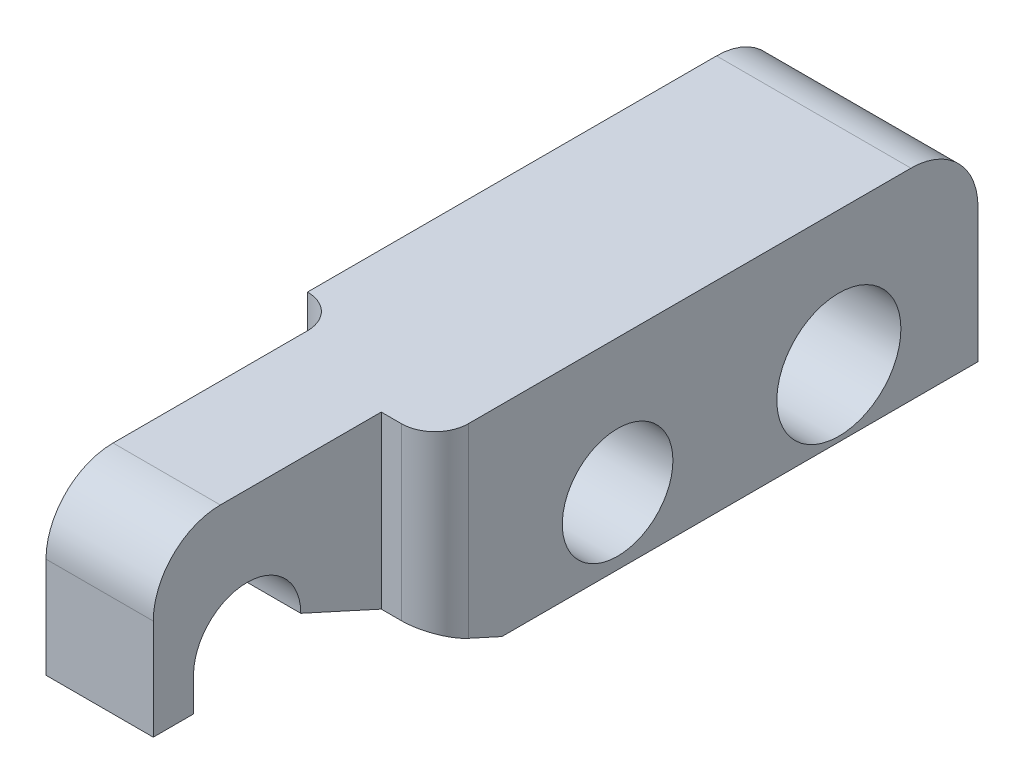
ISO-10303-21;
HEADER;
FILE_DESCRIPTION(('STEP AP214'),'2;1');
FILE_NAME('part.step','',(''),(''),'','','');
FILE_SCHEMA(('AUTOMOTIVE_DESIGN { 1 0 10303 214 1 1 1 1 }'));
ENDSEC;
DATA;
#1=APPLICATION_CONTEXT('core data for automotive mechanical design processes');
#2=APPLICATION_PROTOCOL_DEFINITION('international standard','automotive_design',2000,#1);
#3=PRODUCT_CONTEXT('',#1,'mechanical');
#4=PRODUCT('Part','Part','',(#3));
#5=PRODUCT_RELATED_PRODUCT_CATEGORY('part','',(#4));
#6=PRODUCT_DEFINITION_FORMATION('','',#4);
#7=PRODUCT_DEFINITION_CONTEXT('part definition',#1,'design');
#8=PRODUCT_DEFINITION('design','',#6,#7);
#9=PRODUCT_DEFINITION_SHAPE('','',#8);
#10=(LENGTH_UNIT() NAMED_UNIT(*) SI_UNIT(.MILLI.,.METRE.));
#11=(NAMED_UNIT(*) PLANE_ANGLE_UNIT() SI_UNIT($,.RADIAN.));
#12=(NAMED_UNIT(*) SI_UNIT($,.STERADIAN.) SOLID_ANGLE_UNIT());
#13=UNCERTAINTY_MEASURE_WITH_UNIT(LENGTH_MEASURE(1.E-05),#10,'distance_accuracy_value','');
#14=(GEOMETRIC_REPRESENTATION_CONTEXT(3) GLOBAL_UNCERTAINTY_ASSIGNED_CONTEXT((#13)) GLOBAL_UNIT_ASSIGNED_CONTEXT((#10,
#11,#12)) REPRESENTATION_CONTEXT('',''));
#15=CARTESIAN_POINT('',(0.,0.,0.));
#16=DIRECTION('',(0.,0.,1.));
#17=DIRECTION('',(1.,0.,0.));
#18=AXIS2_PLACEMENT_3D('',#15,#16,#17);
#19=CARTESIAN_POINT('',(2.9,20.,9.425));
#20=DIRECTION('',(0.,0.,-1.));
#21=DIRECTION('',(-1.,0.,0.));
#22=AXIS2_PLACEMENT_3D('',#19,#20,#21);
#23=PLANE('',#22);
#24=DIRECTION('',(0.,1.,0.));
#25=VECTOR('',#24,1.);
#26=CARTESIAN_POINT('',(0.5,19.,9.425));
#27=LINE('',#26,#25);
#28=CARTESIAN_POINT('',(0.5,19.5,9.425));
#29=VERTEX_POINT('',#28);
#30=CARTESIAN_POINT('',(0.5,21.,9.425));
#31=VERTEX_POINT('',#30);
#32=EDGE_CURVE('E250',#29,#31,#27,.T.);
#33=ORIENTED_EDGE('',*,*,#32,.F.);
#34=DIRECTION('',(-1.,0.,0.));
#35=VECTOR('',#34,1.);
#36=CARTESIAN_POINT('',(2.9,19.5,9.425));
#37=LINE('',#36,#35);
#38=CARTESIAN_POINT('',(2.1,19.5,9.425));
#39=VERTEX_POINT('',#38);
#40=EDGE_CURVE('E272',#39,#29,#37,.T.);
#41=ORIENTED_EDGE('',*,*,#40,.F.);
#42=DIRECTION('',(0.,1.,0.));
#43=VECTOR('',#42,1.);
#44=CARTESIAN_POINT('',(2.1,19.,9.425));
#45=LINE('',#44,#43);
#46=CARTESIAN_POINT('',(2.1,21.,9.425));
#47=VERTEX_POINT('',#46);
#48=EDGE_CURVE('E551',#39,#47,#45,.T.);
#49=ORIENTED_EDGE('',*,*,#48,.T.);
#50=DIRECTION('',(-1.,0.,0.));
#51=VECTOR('',#50,1.);
#52=CARTESIAN_POINT('',(2.9,21.,9.425));
#53=LINE('',#52,#51);
#54=EDGE_CURVE('E295',#31,#47,#53,.F.);
#55=ORIENTED_EDGE('',*,*,#54,.F.);
#56=EDGE_LOOP('',(#33,#41,#49,#55));
#57=FACE_BOUND('',#56,.T.);
#58=ADVANCED_FACE('F143',(#57),#23,.F.);
#59=CARTESIAN_POINT('',(2.9,20.,8.025));
#60=DIRECTION('',(-1.,0.,0.));
#61=DIRECTION('',(0.,0.,1.));
#62=AXIS2_PLACEMENT_3D('',#59,#60,#61);
#63=CYLINDRICAL_SURFACE('',#62,0.800000000000001);
#64=DIRECTION('',(-1.,0.,0.));
#65=VECTOR('',#64,1.);
#66=CARTESIAN_POINT('',(2.9,20.,7.225));
#67=LINE('',#66,#65);
#68=CARTESIAN_POINT('',(2.1,20.,7.225));
#69=VERTEX_POINT('',#68);
#70=CARTESIAN_POINT('',(0.500000000000001,20.,7.225));
#71=VERTEX_POINT('',#70);
#72=EDGE_CURVE('E271',#69,#71,#67,.T.);
#73=ORIENTED_EDGE('',*,*,#72,.F.);
#74=CARTESIAN_POINT('',(2.1,20.,8.025));
#75=DIRECTION('',(1.,0.,0.));
#76=DIRECTION('',(0.,0.,1.));
#77=AXIS2_PLACEMENT_3D('',#74,#75,#76);
#78=CIRCLE('',#77,0.800000000000001);
#79=CARTESIAN_POINT('',(2.1,20.,8.825));
#80=VERTEX_POINT('',#79);
#81=EDGE_CURVE('E249',#69,#80,#78,.T.);
#82=ORIENTED_EDGE('',*,*,#81,.T.);
#83=DIRECTION('',(-1.,0.,0.));
#84=VECTOR('',#83,1.);
#85=CARTESIAN_POINT('',(2.9,20.,8.825));
#86=LINE('',#85,#84);
#87=CARTESIAN_POINT('',(0.5,20.,8.825));
#88=VERTEX_POINT('',#87);
#89=EDGE_CURVE('E563',#80,#88,#86,.T.);
#90=ORIENTED_EDGE('',*,*,#89,.T.);
#91=CARTESIAN_POINT('',(0.5,20.,8.025));
#92=DIRECTION('',(1.,0.,0.));
#93=DIRECTION('',(0.,0.,1.));
#94=AXIS2_PLACEMENT_3D('',#91,#92,#93);
#95=CIRCLE('',#94,0.800000000000001);
#96=EDGE_CURVE('E575',#71,#88,#95,.T.);
#97=ORIENTED_EDGE('',*,*,#96,.F.);
#98=EDGE_LOOP('',(#73,#82,#90,#97));
#99=FACE_BOUND('',#98,.T.);
#100=ADVANCED_FACE('F375',(#99),#63,.F.);
#101=CARTESIAN_POINT('',(2.9,22.,9.425));
#102=DIRECTION('',(0.,-1.,0.));
#103=DIRECTION('',(0.,0.,1.));
#104=AXIS2_PLACEMENT_3D('',#101,#102,#103);
#105=PLANE('',#104);
#106=DIRECTION('',(0.,0.,-1.));
#107=VECTOR('',#106,1.);
#108=CARTESIAN_POINT('',(2.9,22.,9.425));
#109=LINE('',#108,#107);
#110=CARTESIAN_POINT('',(2.9,22.,5.525));
#111=VERTEX_POINT('',#110);
#112=CARTESIAN_POINT('',(2.9,22.,-1.075));
#113=VERTEX_POINT('',#112);
#114=EDGE_CURVE('E331',#111,#113,#109,.T.);
#115=ORIENTED_EDGE('',*,*,#114,.T.);
#116=DIRECTION('',(-1.,0.,0.));
#117=VECTOR('',#116,1.);
#118=CARTESIAN_POINT('',(2.9,22.,-1.075));
#119=LINE('',#118,#117);
#120=CARTESIAN_POINT('',(0.,22.,-1.075));
#121=VERTEX_POINT('',#120);
#122=EDGE_CURVE('E281',#121,#113,#119,.F.);
#123=ORIENTED_EDGE('',*,*,#122,.F.);
#124=DIRECTION('',(0.,0.,-1.));
#125=VECTOR('',#124,1.);
#126=CARTESIAN_POINT('',(0.,22.,9.425));
#127=LINE('',#126,#125);
#128=CARTESIAN_POINT('',(0.,22.,5.025));
#129=VERTEX_POINT('',#128);
#130=EDGE_CURVE('E328',#129,#121,#127,.T.);
#131=ORIENTED_EDGE('',*,*,#130,.F.);
#132=CARTESIAN_POINT('',(0.,22.,5.525));
#133=DIRECTION('',(0.,1.,0.));
#134=DIRECTION('',(0.,0.,1.));
#135=AXIS2_PLACEMENT_3D('',#132,#133,#134);
#136=CIRCLE('',#135,0.5);
#137=CARTESIAN_POINT('',(0.500000000000001,22.,5.525));
#138=VERTEX_POINT('',#137);
#139=EDGE_CURVE('E152',#138,#129,#136,.T.);
#140=ORIENTED_EDGE('',*,*,#139,.F.);
#141=DIRECTION('',(0.,0.,-1.));
#142=VECTOR('',#141,1.);
#143=CARTESIAN_POINT('',(0.500000000000001,22.,0.));
#144=LINE('',#143,#142);
#145=CARTESIAN_POINT('',(0.5,22.,8.425));
#146=VERTEX_POINT('',#145);
#147=EDGE_CURVE('E318',#146,#138,#144,.T.);
#148=ORIENTED_EDGE('',*,*,#147,.F.);
#149=DIRECTION('',(-1.,0.,0.));
#150=VECTOR('',#149,1.);
#151=CARTESIAN_POINT('',(2.9,22.,8.425));
#152=LINE('',#151,#150);
#153=CARTESIAN_POINT('',(2.1,22.,8.425));
#154=VERTEX_POINT('',#153);
#155=EDGE_CURVE('E285',#154,#146,#152,.T.);
#156=ORIENTED_EDGE('',*,*,#155,.F.);
#157=DIRECTION('',(0.,0.,-1.));
#158=VECTOR('',#157,1.);
#159=CARTESIAN_POINT('',(2.1,22.,0.));
#160=LINE('',#159,#158);
#161=CARTESIAN_POINT('',(2.1,22.,6.025));
#162=VERTEX_POINT('',#161);
#163=EDGE_CURVE('E586',#154,#162,#160,.T.);
#164=ORIENTED_EDGE('',*,*,#163,.T.);
#165=DIRECTION('',(1.,0.,0.));
#166=VECTOR('',#165,1.);
#167=CARTESIAN_POINT('',(0.,22.,6.025));
#168=LINE('',#167,#166);
#169=CARTESIAN_POINT('',(2.4,22.,6.025));
#170=VERTEX_POINT('',#169);
#171=EDGE_CURVE('E557',#162,#170,#168,.T.);
#172=ORIENTED_EDGE('',*,*,#171,.T.);
#173=CARTESIAN_POINT('',(2.4,22.,5.525));
#174=DIRECTION('',(0.,1.,0.));
#175=DIRECTION('',(0.,0.,1.));
#176=AXIS2_PLACEMENT_3D('',#173,#174,#175);
#177=CIRCLE('',#176,0.5);
#178=EDGE_CURVE('E309',#111,#170,#177,.F.);
#179=ORIENTED_EDGE('',*,*,#178,.F.);
#180=EDGE_LOOP('',(#115,#123,#131,#140,#148,#156,#164,#172,#179));
#181=FACE_BOUND('',#180,.T.);
#182=ADVANCED_FACE('F326',(#181),#105,.F.);
#183=CARTESIAN_POINT('',(2.9,20.,8.825));
#184=DIRECTION('',(0.,0.,-1.));
#185=DIRECTION('',(0.,-1.,0.));
#186=AXIS2_PLACEMENT_3D('',#183,#184,#185);
#187=PLANE('',#186);
#188=ORIENTED_EDGE('',*,*,#89,.F.);
#189=DIRECTION('',(0.,-1.,0.));
#190=VECTOR('',#189,1.);
#191=CARTESIAN_POINT('',(2.1,20.,8.825));
#192=LINE('',#191,#190);
#193=CARTESIAN_POINT('',(2.1,19.5,8.825));
#194=VERTEX_POINT('',#193);
#195=EDGE_CURVE('E578',#80,#194,#192,.T.);
#196=ORIENTED_EDGE('',*,*,#195,.T.);
#197=DIRECTION('',(-1.,0.,0.));
#198=VECTOR('',#197,1.);
#199=CARTESIAN_POINT('',(2.9,19.5,8.825));
#200=LINE('',#199,#198);
#201=CARTESIAN_POINT('',(0.5,19.5,8.825));
#202=VERTEX_POINT('',#201);
#203=EDGE_CURVE('E560',#194,#202,#200,.T.);
#204=ORIENTED_EDGE('',*,*,#203,.T.);
#205=DIRECTION('',(0.,-1.,0.));
#206=VECTOR('',#205,1.);
#207=CARTESIAN_POINT('',(0.5,20.,8.825));
#208=LINE('',#207,#206);
#209=EDGE_CURVE('E572',#88,#202,#208,.T.);
#210=ORIENTED_EDGE('',*,*,#209,.F.);
#211=EDGE_LOOP('',(#188,#196,#204,#210));
#212=FACE_BOUND('',#211,.T.);
#213=ADVANCED_FACE('F401',(#212),#187,.T.);
#214=CARTESIAN_POINT('',(2.9,19.5,0.));
#215=DIRECTION('',(0.,-1.,0.));
#216=DIRECTION('',(0.,0.,1.));
#217=AXIS2_PLACEMENT_3D('',#214,#215,#216);
#218=PLANE('',#217);
#219=ORIENTED_EDGE('',*,*,#203,.F.);
#220=DIRECTION('',(0.,0.,1.));
#221=VECTOR('',#220,1.);
#222=CARTESIAN_POINT('',(2.1,19.5,0.));
#223=LINE('',#222,#221);
#224=EDGE_CURVE('E553',#194,#39,#223,.T.);
#225=ORIENTED_EDGE('',*,*,#224,.T.);
#226=ORIENTED_EDGE('',*,*,#40,.T.);
#227=DIRECTION('',(0.,0.,1.));
#228=VECTOR('',#227,1.);
#229=CARTESIAN_POINT('',(0.500000000000001,19.5,0.));
#230=LINE('',#229,#228);
#231=EDGE_CURVE('E570',#202,#29,#230,.T.);
#232=ORIENTED_EDGE('',*,*,#231,.F.);
#233=EDGE_LOOP('',(#219,#225,#226,#232));
#234=FACE_BOUND('',#233,.T.);
#235=ADVANCED_FACE('F405',(#234),#218,.T.);
#236=CARTESIAN_POINT('',(2.9,17.2782534246575,1.23715753424658));
#237=DIRECTION('',(0.,-0.910366477462605,0.413802944301184));
#238=DIRECTION('',(0.,0.413802944301184,0.910366477462605));
#239=AXIS2_PLACEMENT_3D('',#236,#237,#238);
#240=PLANE('',#239);
#241=DIRECTION('',(-1.,0.,0.));
#242=VECTOR('',#241,1.);
#243=CARTESIAN_POINT('',(2.9,19.4545454545455,6.025));
#244=LINE('',#243,#242);
#245=CARTESIAN_POINT('',(2.4,19.4545454545455,6.025));
#246=VERTEX_POINT('',#245);
#247=CARTESIAN_POINT('',(2.1,19.4545454545455,6.025));
#248=VERTEX_POINT('',#247);
#249=EDGE_CURVE('E282',#246,#248,#244,.T.);
#250=ORIENTED_EDGE('',*,*,#249,.T.);
#251=DIRECTION('',(0.,0.413802944301184,0.910366477462605));
#252=VECTOR('',#251,1.);
#253=CARTESIAN_POINT('',(2.1,17.2782534246575,1.23715753424658));
#254=LINE('',#253,#252);
#255=EDGE_CURVE('E287',#248,#69,#254,.T.);
#256=ORIENTED_EDGE('',*,*,#255,.T.);
#257=ORIENTED_EDGE('',*,*,#72,.T.);
#258=DIRECTION('',(0.,0.413802944301184,0.910366477462605));
#259=VECTOR('',#258,1.);
#260=CARTESIAN_POINT('',(0.500000000000001,17.2782534246575,1.23715753424658));
#261=LINE('',#260,#259);
#262=CARTESIAN_POINT('',(0.500000000000001,19.2272727272727,5.525));
#263=VERTEX_POINT('',#262);
#264=EDGE_CURVE('E277',#263,#71,#261,.T.);
#265=ORIENTED_EDGE('',*,*,#264,.F.);
#266=CARTESIAN_POINT('',(0.,19.2272727272727,5.525));
#267=DIRECTION('',(0.,0.910366477462605,-0.413802944301184));
#268=DIRECTION('',(0.,0.413802944301184,0.910366477462605));
#269=AXIS2_PLACEMENT_3D('',#266,#267,#268);
#270=ELLIPSE('',#269,0.549229362436117,0.5);
#271=CARTESIAN_POINT('',(0.,19.,5.025));
#272=VERTEX_POINT('',#271);
#273=EDGE_CURVE('E12',#272,#263,#270,.F.);
#274=ORIENTED_EDGE('',*,*,#273,.F.);
#275=DIRECTION('',(-1.,0.,0.));
#276=VECTOR('',#275,1.);
#277=CARTESIAN_POINT('',(2.9,19.,5.025));
#278=LINE('',#277,#276);
#279=CARTESIAN_POINT('',(2.9,19.,5.025));
#280=VERTEX_POINT('',#279);
#281=EDGE_CURVE('E265',#280,#272,#278,.T.);
#282=ORIENTED_EDGE('',*,*,#281,.F.);
#283=DIRECTION('',(0.,-0.413802944301184,-0.910366477462605));
#284=VECTOR('',#283,1.);
#285=CARTESIAN_POINT('',(2.9,17.2782534246575,1.23715753424658));
#286=LINE('',#285,#284);
#287=CARTESIAN_POINT('',(2.9,19.2272727272727,5.525));
#288=VERTEX_POINT('',#287);
#289=EDGE_CURVE('E568',#288,#280,#286,.T.);
#290=ORIENTED_EDGE('',*,*,#289,.F.);
#291=CARTESIAN_POINT('',(2.4,19.2272727272727,5.525));
#292=DIRECTION('',(0.,0.910366477462605,-0.413802944301184));
#293=DIRECTION('',(0.,-0.413802944301184,-0.910366477462605));
#294=AXIS2_PLACEMENT_3D('',#291,#292,#293);
#295=ELLIPSE('',#294,0.549229362436117,0.5);
#296=EDGE_CURVE('E314',#246,#288,#295,.T.);
#297=ORIENTED_EDGE('',*,*,#296,.F.);
#298=EDGE_LOOP('',(#250,#256,#257,#265,#274,#282,#290,#297));
#299=FACE_BOUND('',#298,.T.);
#300=ADVANCED_FACE('F275',(#299),#240,.T.);
#301=CARTESIAN_POINT('',(0.,20.,0.));
#302=DIRECTION('',(1.,0.,0.));
#303=DIRECTION('',(0.,0.,-1.));
#304=AXIS2_PLACEMENT_3D('',#301,#302,#303);
#305=PLANE('',#304);
#306=CARTESIAN_POINT('',(0.,20.,0.));
#307=DIRECTION('',(-1.,0.,0.));
#308=DIRECTION('',(0.,0.,-1.));
#309=AXIS2_PLACEMENT_3D('',#306,#307,#308);
#310=CIRCLE('',#309,0.925);
#311=CARTESIAN_POINT('',(0.,20.,-0.925));
#312=VERTEX_POINT('',#311);
#313=EDGE_CURVE('E350',#312,#312,#310,.T.);
#314=ORIENTED_EDGE('',*,*,#313,.F.);
#315=EDGE_LOOP('',(#314));
#316=FACE_BOUND('',#315,.T.);
#317=CARTESIAN_POINT('',(0.,20.,3.3));
#318=DIRECTION('',(-1.,0.,0.));
#319=DIRECTION('',(0.,0.,-1.));
#320=AXIS2_PLACEMENT_3D('',#317,#318,#319);
#321=CIRCLE('',#320,0.825);
#322=CARTESIAN_POINT('',(0.,20.,2.475));
#323=VERTEX_POINT('',#322);
#324=EDGE_CURVE('E334',#323,#323,#321,.T.);
#325=ORIENTED_EDGE('',*,*,#324,.F.);
#326=EDGE_LOOP('',(#325));
#327=FACE_BOUND('',#326,.T.);
#328=DIRECTION('',(0.,1.,0.));
#329=VECTOR('',#328,1.);
#330=CARTESIAN_POINT('',(0.,19.,-2.075));
#331=LINE('',#330,#329);
#332=CARTESIAN_POINT('',(0.,19.,-2.075));
#333=VERTEX_POINT('',#332);
#334=CARTESIAN_POINT('',(0.,21.,-2.075));
#335=VERTEX_POINT('',#334);
#336=EDGE_CURVE('E259',#333,#335,#331,.T.);
#337=ORIENTED_EDGE('',*,*,#336,.F.);
#338=DIRECTION('',(0.,0.,-1.));
#339=VECTOR('',#338,1.);
#340=CARTESIAN_POINT('',(0.,19.,0.));
#341=LINE('',#340,#339);
#342=EDGE_CURVE('E254',#272,#333,#341,.T.);
#343=ORIENTED_EDGE('',*,*,#342,.F.);
#344=DIRECTION('',(0.,1.,0.));
#345=VECTOR('',#344,1.);
#346=CARTESIAN_POINT('',(0.,19.,5.025));
#347=LINE('',#346,#345);
#348=EDGE_CURVE('E242',#272,#129,#347,.T.);
#349=ORIENTED_EDGE('',*,*,#348,.T.);
#350=ORIENTED_EDGE('',*,*,#130,.T.);
#351=CARTESIAN_POINT('',(0.,21.,-1.075));
#352=DIRECTION('',(-1.,0.,0.));
#353=DIRECTION('',(0.,0.,-1.));
#354=AXIS2_PLACEMENT_3D('',#351,#352,#353);
#355=CIRCLE('',#354,1.);
#356=EDGE_CURVE('E302',#335,#121,#355,.F.);
#357=ORIENTED_EDGE('',*,*,#356,.F.);
#358=EDGE_LOOP('',(#337,#343,#349,#350,#357));
#359=FACE_BOUND('',#358,.T.);
#360=ADVANCED_FACE('F256',(#316,#327,#359),#305,.F.);
#361=CARTESIAN_POINT('',(2.9,20.,0.));
#362=DIRECTION('',(1.,0.,0.));
#363=DIRECTION('',(0.,0.,-1.));
#364=AXIS2_PLACEMENT_3D('',#361,#362,#363);
#365=PLANE('',#364);
#366=ORIENTED_EDGE('',*,*,#289,.T.);
#367=DIRECTION('',(0.,0.,-1.));
#368=VECTOR('',#367,1.);
#369=CARTESIAN_POINT('',(2.9,19.,0.));
#370=LINE('',#369,#368);
#371=CARTESIAN_POINT('',(2.9,19.,-2.075));
#372=VERTEX_POINT('',#371);
#373=EDGE_CURVE('E261',#280,#372,#370,.T.);
#374=ORIENTED_EDGE('',*,*,#373,.T.);
#375=DIRECTION('',(0.,1.,0.));
#376=VECTOR('',#375,1.);
#377=CARTESIAN_POINT('',(2.9,19.,-2.075));
#378=LINE('',#377,#376);
#379=CARTESIAN_POINT('',(2.9,21.,-2.075));
#380=VERTEX_POINT('',#379);
#381=EDGE_CURVE('E337',#372,#380,#378,.T.);
#382=ORIENTED_EDGE('',*,*,#381,.T.);
#383=CARTESIAN_POINT('',(2.9,21.,-1.075));
#384=DIRECTION('',(-1.,0.,0.));
#385=DIRECTION('',(0.,0.,-1.));
#386=AXIS2_PLACEMENT_3D('',#383,#384,#385);
#387=CIRCLE('',#386,1.);
#388=EDGE_CURVE('E304',#113,#380,#387,.T.);
#389=ORIENTED_EDGE('',*,*,#388,.F.);
#390=ORIENTED_EDGE('',*,*,#114,.F.);
#391=DIRECTION('',(0.,1.,0.));
#392=VECTOR('',#391,1.);
#393=CARTESIAN_POINT('',(2.9,22.,5.525));
#394=LINE('',#393,#392);
#395=EDGE_CURVE('E307',#288,#111,#394,.T.);
#396=ORIENTED_EDGE('',*,*,#395,.F.);
#397=EDGE_LOOP('',(#366,#374,#382,#389,#390,#396));
#398=FACE_BOUND('',#397,.T.);
#399=CARTESIAN_POINT('',(2.9,20.,0.));
#400=DIRECTION('',(-1.,0.,0.));
#401=DIRECTION('',(0.,0.,-1.));
#402=AXIS2_PLACEMENT_3D('',#399,#400,#401);
#403=CIRCLE('',#402,0.925);
#404=CARTESIAN_POINT('',(2.9,20.,-0.925));
#405=VERTEX_POINT('',#404);
#406=EDGE_CURVE('E347',#405,#405,#403,.T.);
#407=ORIENTED_EDGE('',*,*,#406,.T.);
#408=EDGE_LOOP('',(#407));
#409=FACE_BOUND('',#408,.T.);
#410=CARTESIAN_POINT('',(2.9,20.,3.3));
#411=DIRECTION('',(-1.,0.,0.));
#412=DIRECTION('',(0.,0.,-1.));
#413=AXIS2_PLACEMENT_3D('',#410,#411,#412);
#414=CIRCLE('',#413,0.825);
#415=CARTESIAN_POINT('',(2.9,20.,2.475));
#416=VERTEX_POINT('',#415);
#417=EDGE_CURVE('E329',#416,#416,#414,.T.);
#418=ORIENTED_EDGE('',*,*,#417,.T.);
#419=EDGE_LOOP('',(#418));
#420=FACE_BOUND('',#419,.T.);
#421=ADVANCED_FACE('F357',(#398,#409,#420),#365,.T.);
#422=CARTESIAN_POINT('',(2.9,19.,0.));
#423=DIRECTION('',(0.,-1.,0.));
#424=DIRECTION('',(0.,0.,1.));
#425=AXIS2_PLACEMENT_3D('',#422,#423,#424);
#426=PLANE('',#425);
#427=ORIENTED_EDGE('',*,*,#342,.T.);
#428=DIRECTION('',(-1.,0.,0.));
#429=VECTOR('',#428,1.);
#430=CARTESIAN_POINT('',(2.9,19.,-2.075));
#431=LINE('',#430,#429);
#432=EDGE_CURVE('E262',#372,#333,#431,.T.);
#433=ORIENTED_EDGE('',*,*,#432,.F.);
#434=ORIENTED_EDGE('',*,*,#373,.F.);
#435=ORIENTED_EDGE('',*,*,#281,.T.);
#436=EDGE_LOOP('',(#427,#433,#434,#435));
#437=FACE_BOUND('',#436,.T.);
#438=ADVANCED_FACE('F266',(#437),#426,.T.);
#439=CARTESIAN_POINT('',(2.9,19.,-2.075));
#440=DIRECTION('',(0.,0.,-1.));
#441=DIRECTION('',(-1.,0.,0.));
#442=AXIS2_PLACEMENT_3D('',#439,#440,#441);
#443=PLANE('',#442);
#444=ORIENTED_EDGE('',*,*,#381,.F.);
#445=ORIENTED_EDGE('',*,*,#432,.T.);
#446=ORIENTED_EDGE('',*,*,#336,.T.);
#447=DIRECTION('',(-1.,0.,0.));
#448=VECTOR('',#447,1.);
#449=CARTESIAN_POINT('',(0.,21.,-2.075));
#450=LINE('',#449,#448);
#451=EDGE_CURVE('E300',#380,#335,#450,.T.);
#452=ORIENTED_EDGE('',*,*,#451,.F.);
#453=EDGE_LOOP('',(#444,#445,#446,#452));
#454=FACE_BOUND('',#453,.T.);
#455=ADVANCED_FACE('F360',(#454),#443,.T.);
#456=CARTESIAN_POINT('',(2.9,20.,0.));
#457=DIRECTION('',(-1.,0.,0.));
#458=DIRECTION('',(0.,0.,1.));
#459=AXIS2_PLACEMENT_3D('',#456,#457,#458);
#460=CYLINDRICAL_SURFACE('',#459,0.925);
#461=ORIENTED_EDGE('',*,*,#406,.F.);
#462=EDGE_LOOP('',(#461));
#463=FACE_BOUND('',#462,.T.);
#464=ORIENTED_EDGE('',*,*,#313,.T.);
#465=EDGE_LOOP('',(#464));
#466=FACE_BOUND('',#465,.T.);
#467=ADVANCED_FACE('F389',(#463,#466),#460,.F.);
#468=CARTESIAN_POINT('',(2.9,20.,3.3));
#469=DIRECTION('',(-1.,0.,0.));
#470=DIRECTION('',(0.,0.,1.));
#471=AXIS2_PLACEMENT_3D('',#468,#469,#470);
#472=CYLINDRICAL_SURFACE('',#471,0.825);
#473=ORIENTED_EDGE('',*,*,#417,.F.);
#474=EDGE_LOOP('',(#473));
#475=FACE_BOUND('',#474,.T.);
#476=ORIENTED_EDGE('',*,*,#324,.T.);
#477=EDGE_LOOP('',(#476));
#478=FACE_BOUND('',#477,.T.);
#479=ADVANCED_FACE('F392',(#475,#478),#472,.F.);
#480=CARTESIAN_POINT('',(0.,19.,6.025));
#481=DIRECTION('',(0.,0.,-1.));
#482=DIRECTION('',(-1.,0.,0.));
#483=AXIS2_PLACEMENT_3D('',#480,#481,#482);
#484=PLANE('',#483);
#485=ORIENTED_EDGE('',*,*,#171,.F.);
#486=DIRECTION('',(0.,1.,0.));
#487=VECTOR('',#486,1.);
#488=CARTESIAN_POINT('',(2.1,19.,6.025));
#489=LINE('',#488,#487);
#490=EDGE_CURVE('E323',#248,#162,#489,.T.);
#491=ORIENTED_EDGE('',*,*,#490,.F.);
#492=ORIENTED_EDGE('',*,*,#249,.F.);
#493=DIRECTION('',(0.,1.,0.));
#494=VECTOR('',#493,1.);
#495=CARTESIAN_POINT('',(2.4,19.4545454545455,6.025));
#496=LINE('',#495,#494);
#497=EDGE_CURVE('E312',#170,#246,#496,.F.);
#498=ORIENTED_EDGE('',*,*,#497,.F.);
#499=EDGE_LOOP('',(#485,#491,#492,#498));
#500=FACE_BOUND('',#499,.T.);
#501=ADVANCED_FACE('F395',(#500),#484,.F.);
#502=CARTESIAN_POINT('',(2.1,19.,0.));
#503=DIRECTION('',(-1.,0.,0.));
#504=DIRECTION('',(0.,0.,1.));
#505=AXIS2_PLACEMENT_3D('',#502,#503,#504);
#506=PLANE('',#505);
#507=ORIENTED_EDGE('',*,*,#48,.F.);
#508=ORIENTED_EDGE('',*,*,#224,.F.);
#509=ORIENTED_EDGE('',*,*,#195,.F.);
#510=ORIENTED_EDGE('',*,*,#81,.F.);
#511=ORIENTED_EDGE('',*,*,#255,.F.);
#512=ORIENTED_EDGE('',*,*,#490,.T.);
#513=ORIENTED_EDGE('',*,*,#163,.F.);
#514=CARTESIAN_POINT('',(2.1,21.,8.425));
#515=DIRECTION('',(1.,0.,0.));
#516=DIRECTION('',(0.,0.,1.));
#517=AXIS2_PLACEMENT_3D('',#514,#515,#516);
#518=CIRCLE('',#517,1.);
#519=EDGE_CURVE('E298',#47,#154,#518,.F.);
#520=ORIENTED_EDGE('',*,*,#519,.F.);
#521=EDGE_LOOP('',(#507,#508,#509,#510,#511,#512,#513,#520));
#522=FACE_BOUND('',#521,.T.);
#523=ADVANCED_FACE('F415',(#522),#506,.F.);
#524=CARTESIAN_POINT('',(0.500000000000001,19.,0.));
#525=DIRECTION('',(-1.,0.,0.));
#526=DIRECTION('',(0.,0.,1.));
#527=AXIS2_PLACEMENT_3D('',#524,#525,#526);
#528=PLANE('',#527);
#529=ORIENTED_EDGE('',*,*,#264,.T.);
#530=ORIENTED_EDGE('',*,*,#96,.T.);
#531=ORIENTED_EDGE('',*,*,#209,.T.);
#532=ORIENTED_EDGE('',*,*,#231,.T.);
#533=ORIENTED_EDGE('',*,*,#32,.T.);
#534=CARTESIAN_POINT('',(0.5,21.,8.425));
#535=DIRECTION('',(1.,0.,0.));
#536=DIRECTION('',(0.,0.,1.));
#537=AXIS2_PLACEMENT_3D('',#534,#535,#536);
#538=CIRCLE('',#537,1.);
#539=EDGE_CURVE('E293',#146,#31,#538,.T.);
#540=ORIENTED_EDGE('',*,*,#539,.F.);
#541=ORIENTED_EDGE('',*,*,#147,.T.);
#542=DIRECTION('',(0.,1.,0.));
#543=VECTOR('',#542,1.);
#544=CARTESIAN_POINT('',(0.500000000000001,19.,5.525));
#545=LINE('',#544,#543);
#546=EDGE_CURVE('E159',#263,#138,#545,.T.);
#547=ORIENTED_EDGE('',*,*,#546,.F.);
#548=EDGE_LOOP('',(#529,#530,#531,#532,#533,#540,#541,#547));
#549=FACE_BOUND('',#548,.T.);
#550=ADVANCED_FACE('F319',(#549),#528,.T.);
#551=CARTESIAN_POINT('',(2.9,21.,8.425));
#552=DIRECTION('',(-1.,0.,0.));
#553=DIRECTION('',(0.,0.,1.));
#554=AXIS2_PLACEMENT_3D('',#551,#552,#553);
#555=CYLINDRICAL_SURFACE('',#554,1.);
#556=ORIENTED_EDGE('',*,*,#519,.T.);
#557=ORIENTED_EDGE('',*,*,#155,.T.);
#558=ORIENTED_EDGE('',*,*,#539,.T.);
#559=ORIENTED_EDGE('',*,*,#54,.T.);
#560=EDGE_LOOP('',(#556,#557,#558,#559));
#561=FACE_BOUND('',#560,.T.);
#562=ADVANCED_FACE('F365',(#561),#555,.T.);
#563=CARTESIAN_POINT('',(2.9,21.,-1.075));
#564=DIRECTION('',(1.,0.,0.));
#565=DIRECTION('',(0.,0.,-1.));
#566=AXIS2_PLACEMENT_3D('',#563,#564,#565);
#567=CYLINDRICAL_SURFACE('',#566,1.);
#568=ORIENTED_EDGE('',*,*,#388,.T.);
#569=ORIENTED_EDGE('',*,*,#451,.T.);
#570=ORIENTED_EDGE('',*,*,#356,.T.);
#571=ORIENTED_EDGE('',*,*,#122,.T.);
#572=EDGE_LOOP('',(#568,#569,#570,#571));
#573=FACE_BOUND('',#572,.T.);
#574=ADVANCED_FACE('F362',(#573),#567,.T.);
#575=CARTESIAN_POINT('',(2.4,20.,5.525));
#576=DIRECTION('',(0.,-1.,0.));
#577=DIRECTION('',(0.,0.,1.));
#578=AXIS2_PLACEMENT_3D('',#575,#576,#577);
#579=CYLINDRICAL_SURFACE('',#578,0.5);
#580=ORIENTED_EDGE('',*,*,#296,.T.);
#581=ORIENTED_EDGE('',*,*,#395,.T.);
#582=ORIENTED_EDGE('',*,*,#178,.T.);
#583=ORIENTED_EDGE('',*,*,#497,.T.);
#584=EDGE_LOOP('',(#580,#581,#582,#583));
#585=FACE_BOUND('',#584,.T.);
#586=ADVANCED_FACE('F364',(#585),#579,.T.);
#587=CARTESIAN_POINT('',(0.,19.,5.525));
#588=DIRECTION('',(0.,1.,0.));
#589=DIRECTION('',(0.,0.,-1.));
#590=AXIS2_PLACEMENT_3D('',#587,#588,#589);
#591=CYLINDRICAL_SURFACE('',#590,0.5);
#592=ORIENTED_EDGE('',*,*,#273,.T.);
#593=ORIENTED_EDGE('',*,*,#546,.T.);
#594=ORIENTED_EDGE('',*,*,#139,.T.);
#595=ORIENTED_EDGE('',*,*,#348,.F.);
#596=EDGE_LOOP('',(#592,#593,#594,#595));
#597=FACE_BOUND('',#596,.T.);
#598=ADVANCED_FACE('F145',(#597),#591,.F.);
#599=CLOSED_SHELL('',(#58,#100,#182,#213,#235,#300,#360,#421,#438,#455,#467,#479,#501,#523,#550,
#562,#574,#586,#598));
#600=MANIFOLD_SOLID_BREP('B2',#599);
#601=ADVANCED_BREP_SHAPE_REPRESENTATION('',(#18,#600),#14);
#602=SHAPE_DEFINITION_REPRESENTATION(#9,#601);
ENDSEC;
END-ISO-10303-21;
